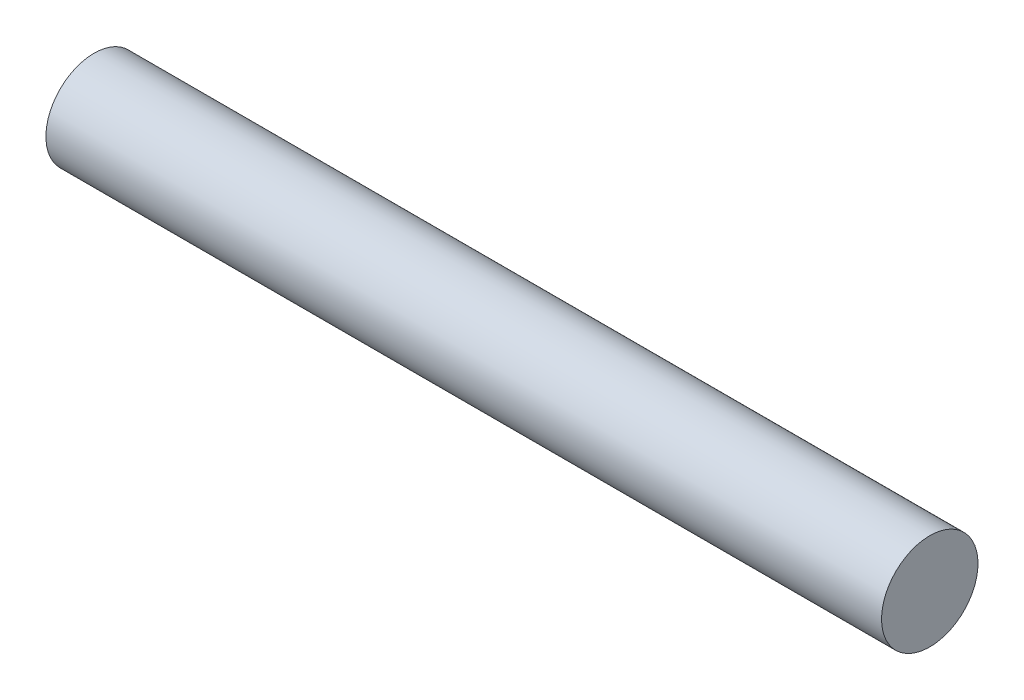
ISO-10303-21;
HEADER;
FILE_DESCRIPTION(('STEP AP214'),'2;1');
FILE_NAME('part.step','',(''),(''),'','','');
FILE_SCHEMA(('AUTOMOTIVE_DESIGN { 1 0 10303 214 1 1 1 1 }'));
ENDSEC;
DATA;
#1=APPLICATION_CONTEXT('core data for automotive mechanical design processes');
#2=APPLICATION_PROTOCOL_DEFINITION('international standard','automotive_design',2000,#1);
#3=PRODUCT_CONTEXT('',#1,'mechanical');
#4=PRODUCT('Part','Part','',(#3));
#5=PRODUCT_RELATED_PRODUCT_CATEGORY('part','',(#4));
#6=PRODUCT_DEFINITION_FORMATION('','',#4);
#7=PRODUCT_DEFINITION_CONTEXT('part definition',#1,'design');
#8=PRODUCT_DEFINITION('design','',#6,#7);
#9=PRODUCT_DEFINITION_SHAPE('','',#8);
#10=(LENGTH_UNIT() NAMED_UNIT(*) SI_UNIT(.MILLI.,.METRE.));
#11=(NAMED_UNIT(*) PLANE_ANGLE_UNIT() SI_UNIT($,.RADIAN.));
#12=(NAMED_UNIT(*) SI_UNIT($,.STERADIAN.) SOLID_ANGLE_UNIT());
#13=UNCERTAINTY_MEASURE_WITH_UNIT(LENGTH_MEASURE(1.E-05),#10,'distance_accuracy_value','');
#14=(GEOMETRIC_REPRESENTATION_CONTEXT(3) GLOBAL_UNCERTAINTY_ASSIGNED_CONTEXT((#13)) GLOBAL_UNIT_ASSIGNED_CONTEXT((#10,
#11,#12)) REPRESENTATION_CONTEXT('',''));
#15=CARTESIAN_POINT('',(0.,0.,0.));
#16=DIRECTION('',(0.,0.,1.));
#17=DIRECTION('',(1.,0.,0.));
#18=AXIS2_PLACEMENT_3D('',#15,#16,#17);
#19=CARTESIAN_POINT('',(65.,0.,0.));
#20=DIRECTION('',(-1.,0.,0.));
#21=DIRECTION('',(0.,0.,1.));
#22=AXIS2_PLACEMENT_3D('',#19,#20,#21);
#23=CYLINDRICAL_SURFACE('',#22,3.75);
#24=CARTESIAN_POINT('',(65.,0.,0.));
#25=DIRECTION('',(1.,0.,0.));
#26=DIRECTION('',(0.,0.,-1.));
#27=AXIS2_PLACEMENT_3D('',#24,#25,#26);
#28=CIRCLE('',#27,3.75);
#29=CARTESIAN_POINT('',(65.,0.,-3.75));
#30=VERTEX_POINT('',#29);
#31=EDGE_CURVE('E10',#30,#30,#28,.T.);
#32=ORIENTED_EDGE('',*,*,#31,.F.);
#33=EDGE_LOOP('',(#32));
#34=FACE_BOUND('',#33,.T.);
#35=CARTESIAN_POINT('',(0.,0.,0.));
#36=DIRECTION('',(1.,0.,0.));
#37=DIRECTION('',(0.,0.,-1.));
#38=AXIS2_PLACEMENT_3D('',#35,#36,#37);
#39=CIRCLE('',#38,3.75);
#40=CARTESIAN_POINT('',(0.,0.,-3.75));
#41=VERTEX_POINT('',#40);
#42=EDGE_CURVE('E35',#41,#41,#39,.T.);
#43=ORIENTED_EDGE('',*,*,#42,.T.);
#44=EDGE_LOOP('',(#43));
#45=FACE_BOUND('',#44,.T.);
#46=ADVANCED_FACE('F32',(#34,#45),#23,.T.);
#47=CARTESIAN_POINT('',(65.,0.,0.));
#48=DIRECTION('',(1.,0.,0.));
#49=DIRECTION('',(0.,0.,-1.));
#50=AXIS2_PLACEMENT_3D('',#47,#48,#49);
#51=PLANE('',#50);
#52=ORIENTED_EDGE('',*,*,#31,.T.);
#53=EDGE_LOOP('',(#52));
#54=FACE_BOUND('',#53,.T.);
#55=ADVANCED_FACE('F47',(#54),#51,.T.);
#56=CARTESIAN_POINT('',(0.,0.,0.));
#57=DIRECTION('',(1.,0.,0.));
#58=DIRECTION('',(0.,0.,-1.));
#59=AXIS2_PLACEMENT_3D('',#56,#57,#58);
#60=PLANE('',#59);
#61=ORIENTED_EDGE('',*,*,#42,.F.);
#62=EDGE_LOOP('',(#61));
#63=FACE_BOUND('',#62,.T.);
#64=ADVANCED_FACE('F45',(#63),#60,.F.);
#65=CLOSED_SHELL('',(#46,#55,#64));
#66=MANIFOLD_SOLID_BREP('B2',#65);
#67=ADVANCED_BREP_SHAPE_REPRESENTATION('',(#18,#66),#14);
#68=SHAPE_DEFINITION_REPRESENTATION(#9,#67);
ENDSEC;
END-ISO-10303-21;
